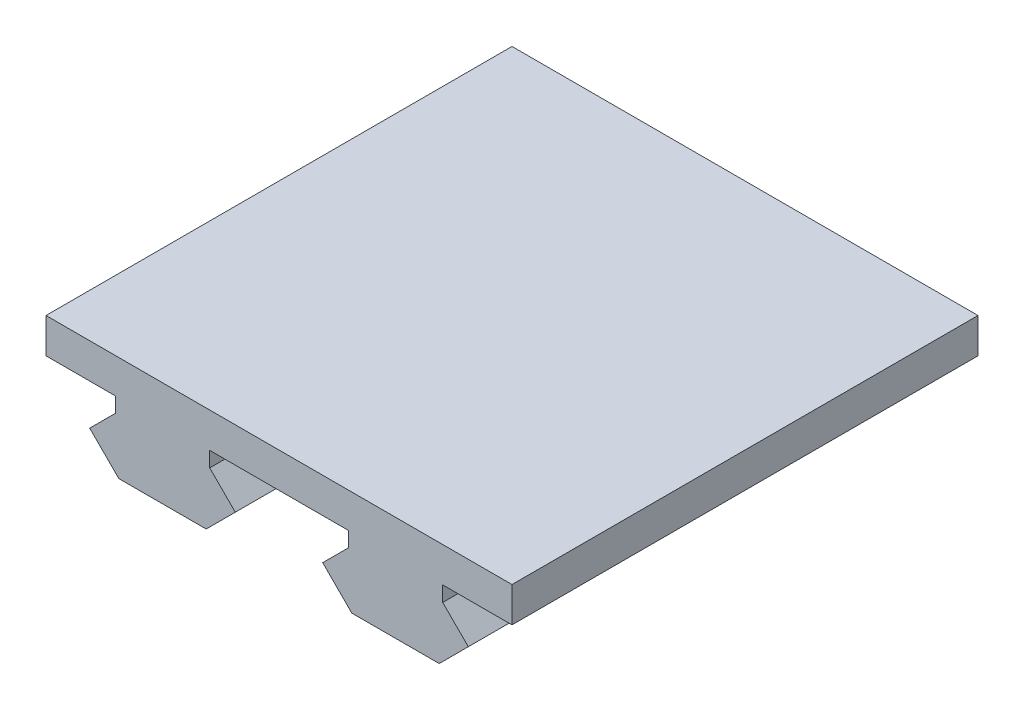
ISO-10303-21;
HEADER;
FILE_DESCRIPTION(('STEP AP214'),'2;1');
FILE_NAME('part.step','',(''),(''),'','','');
FILE_SCHEMA(('AUTOMOTIVE_DESIGN { 1 0 10303 214 1 1 1 1 }'));
ENDSEC;
DATA;
#1=APPLICATION_CONTEXT('core data for automotive mechanical design processes');
#2=APPLICATION_PROTOCOL_DEFINITION('international standard','automotive_design',2000,#1);
#3=PRODUCT_CONTEXT('',#1,'mechanical');
#4=PRODUCT('Part','Part','',(#3));
#5=PRODUCT_RELATED_PRODUCT_CATEGORY('part','',(#4));
#6=PRODUCT_DEFINITION_FORMATION('','',#4);
#7=PRODUCT_DEFINITION_CONTEXT('part definition',#1,'design');
#8=PRODUCT_DEFINITION('design','',#6,#7);
#9=PRODUCT_DEFINITION_SHAPE('','',#8);
#10=(LENGTH_UNIT() NAMED_UNIT(*) SI_UNIT(.MILLI.,.METRE.));
#11=(NAMED_UNIT(*) PLANE_ANGLE_UNIT() SI_UNIT($,.RADIAN.));
#12=(NAMED_UNIT(*) SI_UNIT($,.STERADIAN.) SOLID_ANGLE_UNIT());
#13=UNCERTAINTY_MEASURE_WITH_UNIT(LENGTH_MEASURE(1.E-05),#10,'distance_accuracy_value','');
#14=(GEOMETRIC_REPRESENTATION_CONTEXT(3) GLOBAL_UNCERTAINTY_ASSIGNED_CONTEXT((#13)) GLOBAL_UNIT_ASSIGNED_CONTEXT((#10,
#11,#12)) REPRESENTATION_CONTEXT('',''));
#15=CARTESIAN_POINT('',(0.,0.,0.));
#16=DIRECTION('',(0.,0.,1.));
#17=DIRECTION('',(1.,0.,0.));
#18=AXIS2_PLACEMENT_3D('',#15,#16,#17);
#19=CARTESIAN_POINT('',(3.75,-3.50000000000003,-33.865424623862));
#20=DIRECTION('',(0.707106781186551,-0.707106781186544,0.));
#21=DIRECTION('',(0.707106781186544,0.707106781186551,0.));
#22=AXIS2_PLACEMENT_3D('',#19,#20,#21);
#23=PLANE('',#22);
#24=DIRECTION('',(-0.707106781186544,-0.707106781186551,0.));
#25=VECTOR('',#24,1.);
#26=CARTESIAN_POINT('',(3.75,-3.50000000000003,-6.66666666666667));
#27=LINE('',#26,#25);
#28=CARTESIAN_POINT('',(5.9464983078676,-1.3035016921324,-6.66666666666667));
#29=VERTEX_POINT('',#28);
#30=CARTESIAN_POINT('',(3.75,-3.50000000000003,-6.66666666666667));
#31=VERTEX_POINT('',#30);
#32=EDGE_CURVE('E275',#29,#31,#27,.T.);
#33=ORIENTED_EDGE('',*,*,#32,.F.);
#34=DIRECTION('',(0.,0.,1.));
#35=VECTOR('',#34,1.);
#36=CARTESIAN_POINT('',(5.9464983078676,-1.3035016921324,-33.865424623862));
#37=LINE('',#36,#35);
#38=CARTESIAN_POINT('',(5.9464983078676,-1.3035016921324,-20.));
#39=VERTEX_POINT('',#38);
#40=EDGE_CURVE('E305',#39,#29,#37,.T.);
#41=ORIENTED_EDGE('',*,*,#40,.F.);
#42=DIRECTION('',(-0.707106781186544,-0.707106781186551,0.));
#43=VECTOR('',#42,1.);
#44=CARTESIAN_POINT('',(3.75,-3.50000000000003,-20.));
#45=LINE('',#44,#43);
#46=CARTESIAN_POINT('',(3.75,-3.50000000000003,-20.));
#47=VERTEX_POINT('',#46);
#48=EDGE_CURVE('E309',#39,#47,#45,.T.);
#49=ORIENTED_EDGE('',*,*,#48,.T.);
#50=DIRECTION('',(0.,0.,1.));
#51=VECTOR('',#50,1.);
#52=CARTESIAN_POINT('',(3.75,-3.50000000000003,-33.865424623862));
#53=LINE('',#52,#51);
#54=EDGE_CURVE('E301',#47,#31,#53,.T.);
#55=ORIENTED_EDGE('',*,*,#54,.T.);
#56=EDGE_LOOP('',(#33,#41,#49,#55));
#57=FACE_BOUND('',#56,.T.);
#58=ADVANCED_FACE('F33',(#57),#23,.F.);
#59=CARTESIAN_POINT('',(6.25,-6.,-33.865424623862));
#60=DIRECTION('',(0.707106781186544,0.707106781186551,0.));
#61=DIRECTION('',(-0.707106781186551,0.707106781186544,0.));
#62=AXIS2_PLACEMENT_3D('',#59,#60,#61);
#63=PLANE('',#62);
#64=DIRECTION('',(0.707106781186551,-0.707106781186544,0.));
#65=VECTOR('',#64,1.);
#66=CARTESIAN_POINT('',(6.25,-6.,-6.66666666666667));
#67=LINE('',#66,#65);
#68=CARTESIAN_POINT('',(6.25,-6.,-6.66666666666667));
#69=VERTEX_POINT('',#68);
#70=EDGE_CURVE('E530',#31,#69,#67,.T.);
#71=ORIENTED_EDGE('',*,*,#70,.F.);
#72=ORIENTED_EDGE('',*,*,#54,.F.);
#73=DIRECTION('',(0.707106781186551,-0.707106781186544,0.));
#74=VECTOR('',#73,1.);
#75=CARTESIAN_POINT('',(6.25,-6.,-20.));
#76=LINE('',#75,#74);
#77=CARTESIAN_POINT('',(6.25,-6.,-20.));
#78=VERTEX_POINT('',#77);
#79=EDGE_CURVE('E312',#47,#78,#76,.T.);
#80=ORIENTED_EDGE('',*,*,#79,.T.);
#81=DIRECTION('',(0.,0.,1.));
#82=VECTOR('',#81,1.);
#83=CARTESIAN_POINT('',(6.25,-6.,-33.865424623862));
#84=LINE('',#83,#82);
#85=EDGE_CURVE('E291',#78,#69,#84,.T.);
#86=ORIENTED_EDGE('',*,*,#85,.T.);
#87=EDGE_LOOP('',(#71,#72,#80,#86));
#88=FACE_BOUND('',#87,.T.);
#89=ADVANCED_FACE('F552',(#88),#63,.F.);
#90=CARTESIAN_POINT('',(13.75,-6.,-33.865424623862));
#91=DIRECTION('',(0.,1.,0.));
#92=DIRECTION('',(-1.,0.,0.));
#93=AXIS2_PLACEMENT_3D('',#90,#91,#92);
#94=PLANE('',#93);
#95=DIRECTION('',(-1.,0.,0.));
#96=VECTOR('',#95,1.);
#97=CARTESIAN_POINT('',(20.,-6.,-6.66666666666667));
#98=LINE('',#97,#96);
#99=CARTESIAN_POINT('',(13.75,-6.,-6.66666666666667));
#100=VERTEX_POINT('',#99);
#101=EDGE_CURVE('E539',#100,#69,#98,.T.);
#102=ORIENTED_EDGE('',*,*,#101,.T.);
#103=ORIENTED_EDGE('',*,*,#85,.F.);
#104=DIRECTION('',(1.,0.,0.));
#105=VECTOR('',#104,1.);
#106=CARTESIAN_POINT('',(13.75,-6.,-20.));
#107=LINE('',#106,#105);
#108=CARTESIAN_POINT('',(13.75,-6.,-20.));
#109=VERTEX_POINT('',#108);
#110=EDGE_CURVE('E520',#78,#109,#107,.T.);
#111=ORIENTED_EDGE('',*,*,#110,.T.);
#112=DIRECTION('',(0.,0.,1.));
#113=VECTOR('',#112,1.);
#114=CARTESIAN_POINT('',(13.75,-6.,-33.865424623862));
#115=LINE('',#114,#113);
#116=EDGE_CURVE('E290',#109,#100,#115,.T.);
#117=ORIENTED_EDGE('',*,*,#116,.T.);
#118=EDGE_LOOP('',(#102,#103,#111,#117));
#119=FACE_BOUND('',#118,.T.);
#120=ADVANCED_FACE('F547',(#119),#94,.F.);
#121=CARTESIAN_POINT('',(13.75,-6.,-33.865424623862));
#122=DIRECTION('',(-0.707106781186543,0.707106781186551,0.));
#123=DIRECTION('',(-0.707106781186552,-0.707106781186543,0.));
#124=AXIS2_PLACEMENT_3D('',#121,#122,#123);
#125=PLANE('',#124);
#126=DIRECTION('',(0.707106781186552,0.707106781186543,0.));
#127=VECTOR('',#126,1.);
#128=CARTESIAN_POINT('',(13.75,-6.,-6.66666666666667));
#129=LINE('',#128,#127);
#130=CARTESIAN_POINT('',(16.25,-3.50000000000003,-6.66666666666667));
#131=VERTEX_POINT('',#130);
#132=EDGE_CURVE('E512',#100,#131,#129,.T.);
#133=ORIENTED_EDGE('',*,*,#132,.F.);
#134=ORIENTED_EDGE('',*,*,#116,.F.);
#135=DIRECTION('',(0.707106781186552,0.707106781186543,0.));
#136=VECTOR('',#135,1.);
#137=CARTESIAN_POINT('',(13.75,-6.,-20.));
#138=LINE('',#137,#136);
#139=CARTESIAN_POINT('',(16.25,-3.50000000000003,-20.));
#140=VERTEX_POINT('',#139);
#141=EDGE_CURVE('E518',#109,#140,#138,.T.);
#142=ORIENTED_EDGE('',*,*,#141,.T.);
#143=DIRECTION('',(0.,0.,1.));
#144=VECTOR('',#143,1.);
#145=CARTESIAN_POINT('',(16.25,-3.50000000000003,-33.865424623862));
#146=LINE('',#145,#144);
#147=EDGE_CURVE('E298',#140,#131,#146,.T.);
#148=ORIENTED_EDGE('',*,*,#147,.T.);
#149=EDGE_LOOP('',(#133,#134,#142,#148));
#150=FACE_BOUND('',#149,.T.);
#151=ADVANCED_FACE('F556',(#150),#125,.F.);
#152=CARTESIAN_POINT('',(16.25,-3.50000000000003,-33.865424623862));
#153=DIRECTION('',(-0.707106781186551,-0.707106781186544,0.));
#154=DIRECTION('',(0.707106781186544,-0.707106781186551,0.));
#155=AXIS2_PLACEMENT_3D('',#152,#153,#154);
#156=PLANE('',#155);
#157=DIRECTION('',(-0.707106781186544,0.707106781186551,0.));
#158=VECTOR('',#157,1.);
#159=CARTESIAN_POINT('',(16.25,-3.50000000000003,-6.66666666666667));
#160=LINE('',#159,#158);
#161=CARTESIAN_POINT('',(14.0535016921324,-1.3035016921324,-6.66666666666667));
#162=VERTEX_POINT('',#161);
#163=EDGE_CURVE('E526',#131,#162,#160,.T.);
#164=ORIENTED_EDGE('',*,*,#163,.F.);
#165=ORIENTED_EDGE('',*,*,#147,.F.);
#166=DIRECTION('',(-0.707106781186544,0.707106781186551,0.));
#167=VECTOR('',#166,1.);
#168=CARTESIAN_POINT('',(16.25,-3.50000000000003,-20.));
#169=LINE('',#168,#167);
#170=CARTESIAN_POINT('',(14.0535016921324,-1.30350169213241,-20.));
#171=VERTEX_POINT('',#170);
#172=EDGE_CURVE('E516',#140,#171,#169,.T.);
#173=ORIENTED_EDGE('',*,*,#172,.T.);
#174=DIRECTION('',(0.,0.,1.));
#175=VECTOR('',#174,1.);
#176=CARTESIAN_POINT('',(14.0535016921324,-1.3035016921324,-33.865424623862));
#177=LINE('',#176,#175);
#178=EDGE_CURVE('E486',#171,#162,#177,.T.);
#179=ORIENTED_EDGE('',*,*,#178,.T.);
#180=EDGE_LOOP('',(#164,#165,#173,#179));
#181=FACE_BOUND('',#180,.T.);
#182=ADVANCED_FACE('F559',(#181),#156,.F.);
#183=CARTESIAN_POINT('',(14.0535016921324,-1.3035016921324,-33.865424623862));
#184=DIRECTION('',(-1.,0.,0.));
#185=DIRECTION('',(0.,-1.,0.));
#186=AXIS2_PLACEMENT_3D('',#183,#184,#185);
#187=PLANE('',#186);
#188=DIRECTION('',(0.,1.,0.));
#189=VECTOR('',#188,1.);
#190=CARTESIAN_POINT('',(14.0535016921324,-1.3035016921324,-6.66666666666667));
#191=LINE('',#190,#189);
#192=CARTESIAN_POINT('',(14.0535016921324,0.,-6.66666666666667));
#193=VERTEX_POINT('',#192);
#194=EDGE_CURVE('E528',#162,#193,#191,.T.);
#195=ORIENTED_EDGE('',*,*,#194,.F.);
#196=ORIENTED_EDGE('',*,*,#178,.F.);
#197=DIRECTION('',(0.,1.,0.));
#198=VECTOR('',#197,1.);
#199=CARTESIAN_POINT('',(14.0535016921324,-1.3035016921324,-20.));
#200=LINE('',#199,#198);
#201=CARTESIAN_POINT('',(14.0535016921324,0.,-20.));
#202=VERTEX_POINT('',#201);
#203=EDGE_CURVE('E514',#171,#202,#200,.T.);
#204=ORIENTED_EDGE('',*,*,#203,.T.);
#205=DIRECTION('',(0.,0.,1.));
#206=VECTOR('',#205,1.);
#207=CARTESIAN_POINT('',(14.0535016921324,0.,-33.865424623862));
#208=LINE('',#207,#206);
#209=EDGE_CURVE('E483',#202,#193,#208,.T.);
#210=ORIENTED_EDGE('',*,*,#209,.T.);
#211=EDGE_LOOP('',(#195,#196,#204,#210));
#212=FACE_BOUND('',#211,.T.);
#213=ADVANCED_FACE('F561',(#212),#187,.F.);
#214=CARTESIAN_POINT('',(5.9464983078676,-1.3035016921324,-33.865424623862));
#215=DIRECTION('',(1.,0.,0.));
#216=DIRECTION('',(0.,1.,0.));
#217=AXIS2_PLACEMENT_3D('',#214,#215,#216);
#218=PLANE('',#217);
#219=DIRECTION('',(0.,-1.,0.));
#220=VECTOR('',#219,1.);
#221=CARTESIAN_POINT('',(5.9464983078676,-1.3035016921324,-6.66666666666667));
#222=LINE('',#221,#220);
#223=CARTESIAN_POINT('',(5.9464983078676,0.,-6.66666666666667));
#224=VERTEX_POINT('',#223);
#225=EDGE_CURVE('E11',#224,#29,#222,.T.);
#226=ORIENTED_EDGE('',*,*,#225,.F.);
#227=DIRECTION('',(0.,0.,1.));
#228=VECTOR('',#227,1.);
#229=CARTESIAN_POINT('',(5.9464983078676,0.,-33.865424623862));
#230=LINE('',#229,#228);
#231=CARTESIAN_POINT('',(5.9464983078676,0.,-20.));
#232=VERTEX_POINT('',#231);
#233=EDGE_CURVE('E56',#232,#224,#230,.T.);
#234=ORIENTED_EDGE('',*,*,#233,.F.);
#235=DIRECTION('',(0.,-1.,0.));
#236=VECTOR('',#235,1.);
#237=CARTESIAN_POINT('',(5.9464983078676,-1.3035016921324,-20.));
#238=LINE('',#237,#236);
#239=EDGE_CURVE('E324',#232,#39,#238,.T.);
#240=ORIENTED_EDGE('',*,*,#239,.T.);
#241=ORIENTED_EDGE('',*,*,#40,.T.);
#242=EDGE_LOOP('',(#226,#234,#240,#241));
#243=FACE_BOUND('',#242,.T.);
#244=ADVANCED_FACE('F567',(#243),#218,.F.);
#245=CARTESIAN_POINT('',(0.,0.,0.));
#246=DIRECTION('',(0.,-1.,0.));
#247=DIRECTION('',(0.,0.,-1.));
#248=AXIS2_PLACEMENT_3D('',#245,#246,#247);
#249=PLANE('',#248);
#250=ORIENTED_EDGE('',*,*,#233,.T.);
#251=DIRECTION('',(-1.,0.,0.));
#252=VECTOR('',#251,1.);
#253=CARTESIAN_POINT('',(20.,0.,-6.66666666666667));
#254=LINE('',#253,#252);
#255=EDGE_CURVE('E542',#193,#224,#254,.T.);
#256=ORIENTED_EDGE('',*,*,#255,.F.);
#257=ORIENTED_EDGE('',*,*,#209,.F.);
#258=DIRECTION('',(-1.,0.,0.));
#259=VECTOR('',#258,1.);
#260=CARTESIAN_POINT('',(-20.,0.,-20.));
#261=LINE('',#260,#259);
#262=CARTESIAN_POINT('',(20.,0.,-20.));
#263=VERTEX_POINT('',#262);
#264=EDGE_CURVE('E431',#263,#202,#261,.T.);
#265=ORIENTED_EDGE('',*,*,#264,.F.);
#266=DIRECTION('',(0.,0.,-1.));
#267=VECTOR('',#266,1.);
#268=CARTESIAN_POINT('',(20.,0.,20.));
#269=LINE('',#268,#267);
#270=CARTESIAN_POINT('',(20.,0.,20.));
#271=VERTEX_POINT('',#270);
#272=EDGE_CURVE('E366',#271,#263,#269,.T.);
#273=ORIENTED_EDGE('',*,*,#272,.F.);
#274=DIRECTION('',(1.,0.,0.));
#275=VECTOR('',#274,1.);
#276=CARTESIAN_POINT('',(-20.,0.,20.));
#277=LINE('',#276,#275);
#278=CARTESIAN_POINT('',(14.0535016921324,0.,20.));
#279=VERTEX_POINT('',#278);
#280=EDGE_CURVE('E437',#279,#271,#277,.T.);
#281=ORIENTED_EDGE('',*,*,#280,.F.);
#282=CARTESIAN_POINT('',(14.0535016921324,0.,6.66666666666667));
#283=VERTEX_POINT('',#282);
#284=EDGE_CURVE('E485',#283,#279,#208,.T.);
#285=ORIENTED_EDGE('',*,*,#284,.F.);
#286=DIRECTION('',(-1.,0.,0.));
#287=VECTOR('',#286,1.);
#288=CARTESIAN_POINT('',(20.,0.,6.66666666666667));
#289=LINE('',#288,#287);
#290=CARTESIAN_POINT('',(5.9464983078676,0.,6.66666666666667));
#291=VERTEX_POINT('',#290);
#292=EDGE_CURVE('E284',#283,#291,#289,.T.);
#293=ORIENTED_EDGE('',*,*,#292,.T.);
#294=CARTESIAN_POINT('',(5.9464983078676,0.,20.));
#295=VERTEX_POINT('',#294);
#296=EDGE_CURVE('E462',#291,#295,#230,.T.);
#297=ORIENTED_EDGE('',*,*,#296,.T.);
#298=CARTESIAN_POINT('',(-5.9464983078676,0.,20.));
#299=VERTEX_POINT('',#298);
#300=EDGE_CURVE('E440',#299,#295,#277,.T.);
#301=ORIENTED_EDGE('',*,*,#300,.F.);
#302=DIRECTION('',(0.,0.,1.));
#303=VECTOR('',#302,1.);
#304=CARTESIAN_POINT('',(-5.9464983078676,0.,-33.865424623862));
#305=LINE('',#304,#303);
#306=CARTESIAN_POINT('',(-5.9464983078676,0.,6.66666666666667));
#307=VERTEX_POINT('',#306);
#308=EDGE_CURVE('E387',#307,#299,#305,.T.);
#309=ORIENTED_EDGE('',*,*,#308,.F.);
#310=DIRECTION('',(1.,0.,0.));
#311=VECTOR('',#310,1.);
#312=CARTESIAN_POINT('',(-20.,0.,6.66666666666667));
#313=LINE('',#312,#311);
#314=CARTESIAN_POINT('',(-14.0535016921324,0.,6.66666666666667));
#315=VERTEX_POINT('',#314);
#316=EDGE_CURVE('E317',#315,#307,#313,.T.);
#317=ORIENTED_EDGE('',*,*,#316,.F.);
#318=DIRECTION('',(0.,0.,1.));
#319=VECTOR('',#318,1.);
#320=CARTESIAN_POINT('',(-14.0535016921324,0.,-33.865424623862));
#321=LINE('',#320,#319);
#322=CARTESIAN_POINT('',(-14.0535016921324,0.,20.));
#323=VERTEX_POINT('',#322);
#324=EDGE_CURVE('E414',#315,#323,#321,.T.);
#325=ORIENTED_EDGE('',*,*,#324,.T.);
#326=CARTESIAN_POINT('',(-20.,0.,20.));
#327=VERTEX_POINT('',#326);
#328=EDGE_CURVE('E422',#327,#323,#277,.T.);
#329=ORIENTED_EDGE('',*,*,#328,.F.);
#330=DIRECTION('',(0.,0.,1.));
#331=VECTOR('',#330,1.);
#332=CARTESIAN_POINT('',(-20.,0.,20.));
#333=LINE('',#332,#331);
#334=CARTESIAN_POINT('',(-20.,0.,-20.));
#335=VERTEX_POINT('',#334);
#336=EDGE_CURVE('E434',#335,#327,#333,.T.);
#337=ORIENTED_EDGE('',*,*,#336,.F.);
#338=CARTESIAN_POINT('',(-14.0535016921324,0.,-20.));
#339=VERTEX_POINT('',#338);
#340=EDGE_CURVE('E430',#339,#335,#261,.T.);
#341=ORIENTED_EDGE('',*,*,#340,.F.);
#342=CARTESIAN_POINT('',(-14.0535016921324,0.,-6.66666666666667));
#343=VERTEX_POINT('',#342);
#344=EDGE_CURVE('E411',#339,#343,#321,.T.);
#345=ORIENTED_EDGE('',*,*,#344,.T.);
#346=DIRECTION('',(1.,0.,0.));
#347=VECTOR('',#346,1.);
#348=CARTESIAN_POINT('',(-20.,0.,-6.66666666666667));
#349=LINE('',#348,#347);
#350=CARTESIAN_POINT('',(-5.9464983078676,0.,-6.66666666666667));
#351=VERTEX_POINT('',#350);
#352=EDGE_CURVE('E319',#343,#351,#349,.T.);
#353=ORIENTED_EDGE('',*,*,#352,.T.);
#354=CARTESIAN_POINT('',(-5.9464983078676,0.,-20.));
#355=VERTEX_POINT('',#354);
#356=EDGE_CURVE('E415',#355,#351,#305,.T.);
#357=ORIENTED_EDGE('',*,*,#356,.F.);
#358=EDGE_CURVE('E435',#232,#355,#261,.T.);
#359=ORIENTED_EDGE('',*,*,#358,.F.);
#360=EDGE_LOOP('',(#250,#256,#257,#265,#273,#281,#285,#293,#297,#301,#309,#317,#325,#329,#337,
#341,#345,#353,#357,#359));
#361=FACE_BOUND('',#360,.T.);
#362=ADVANCED_FACE('F638',(#361),#249,.T.);
#363=CARTESIAN_POINT('',(-5.9464983078676,-1.3035016921324,-33.865424623862));
#364=DIRECTION('',(1.,0.,0.));
#365=DIRECTION('',(0.,1.,0.));
#366=AXIS2_PLACEMENT_3D('',#363,#364,#365);
#367=PLANE('',#366);
#368=DIRECTION('',(0.,0.,1.));
#369=VECTOR('',#368,1.);
#370=CARTESIAN_POINT('',(-5.9464983078676,-1.3035016921324,-33.865424623862));
#371=LINE('',#370,#369);
#372=CARTESIAN_POINT('',(-5.9464983078676,-1.3035016921324,6.66666666666667));
#373=VERTEX_POINT('',#372);
#374=CARTESIAN_POINT('',(-5.9464983078676,-1.3035016921324,20.));
#375=VERTEX_POINT('',#374);
#376=EDGE_CURVE('E390',#373,#375,#371,.T.);
#377=ORIENTED_EDGE('',*,*,#376,.F.);
#378=DIRECTION('',(0.,1.,0.));
#379=VECTOR('',#378,1.);
#380=CARTESIAN_POINT('',(-5.9464983078676,-1.3035016921324,6.66666666666667));
#381=LINE('',#380,#379);
#382=EDGE_CURVE('E346',#373,#307,#381,.T.);
#383=ORIENTED_EDGE('',*,*,#382,.T.);
#384=ORIENTED_EDGE('',*,*,#308,.T.);
#385=DIRECTION('',(0.,1.,0.));
#386=VECTOR('',#385,1.);
#387=CARTESIAN_POINT('',(-5.9464983078676,-1.3035016921324,20.));
#388=LINE('',#387,#386);
#389=EDGE_CURVE('E349',#375,#299,#388,.T.);
#390=ORIENTED_EDGE('',*,*,#389,.F.);
#391=EDGE_LOOP('',(#377,#383,#384,#390));
#392=FACE_BOUND('',#391,.T.);
#393=ADVANCED_FACE('F635',(#392),#367,.T.);
#394=CARTESIAN_POINT('',(-3.75,-3.50000000000003,-33.865424623862));
#395=DIRECTION('',(0.707106781186551,0.707106781186544,0.));
#396=DIRECTION('',(-0.707106781186544,0.707106781186551,0.));
#397=AXIS2_PLACEMENT_3D('',#394,#395,#396);
#398=PLANE('',#397);
#399=DIRECTION('',(0.,0.,1.));
#400=VECTOR('',#399,1.);
#401=CARTESIAN_POINT('',(-3.75,-3.50000000000003,-33.865424623862));
#402=LINE('',#401,#400);
#403=CARTESIAN_POINT('',(-3.75,-3.50000000000003,6.66666666666667));
#404=VERTEX_POINT('',#403);
#405=CARTESIAN_POINT('',(-3.75,-3.50000000000003,20.));
#406=VERTEX_POINT('',#405);
#407=EDGE_CURVE('E394',#404,#406,#402,.T.);
#408=ORIENTED_EDGE('',*,*,#407,.F.);
#409=DIRECTION('',(-0.707106781186544,0.707106781186551,0.));
#410=VECTOR('',#409,1.);
#411=CARTESIAN_POINT('',(-3.75,-3.50000000000003,6.66666666666667));
#412=LINE('',#411,#410);
#413=EDGE_CURVE('E343',#404,#373,#412,.T.);
#414=ORIENTED_EDGE('',*,*,#413,.T.);
#415=ORIENTED_EDGE('',*,*,#376,.T.);
#416=DIRECTION('',(-0.707106781186544,0.707106781186551,0.));
#417=VECTOR('',#416,1.);
#418=CARTESIAN_POINT('',(-3.75,-3.50000000000003,20.));
#419=LINE('',#418,#417);
#420=EDGE_CURVE('E384',#406,#375,#419,.T.);
#421=ORIENTED_EDGE('',*,*,#420,.F.);
#422=EDGE_LOOP('',(#408,#414,#415,#421));
#423=FACE_BOUND('',#422,.T.);
#424=ADVANCED_FACE('F607',(#423),#398,.T.);
#425=CARTESIAN_POINT('',(-6.25,-6.,-33.865424623862));
#426=DIRECTION('',(0.707106781186544,-0.707106781186551,0.));
#427=DIRECTION('',(0.707106781186551,0.707106781186544,0.));
#428=AXIS2_PLACEMENT_3D('',#425,#426,#427);
#429=PLANE('',#428);
#430=DIRECTION('',(0.,0.,1.));
#431=VECTOR('',#430,1.);
#432=CARTESIAN_POINT('',(-6.25,-6.,-33.865424623862));
#433=LINE('',#432,#431);
#434=CARTESIAN_POINT('',(-6.25,-6.,6.66666666666667));
#435=VERTEX_POINT('',#434);
#436=CARTESIAN_POINT('',(-6.25,-6.,20.));
#437=VERTEX_POINT('',#436);
#438=EDGE_CURVE('E398',#435,#437,#433,.T.);
#439=ORIENTED_EDGE('',*,*,#438,.F.);
#440=DIRECTION('',(0.707106781186551,0.707106781186544,0.));
#441=VECTOR('',#440,1.);
#442=CARTESIAN_POINT('',(-6.25,-6.,6.66666666666667));
#443=LINE('',#442,#441);
#444=EDGE_CURVE('E340',#435,#404,#443,.T.);
#445=ORIENTED_EDGE('',*,*,#444,.T.);
#446=ORIENTED_EDGE('',*,*,#407,.T.);
#447=DIRECTION('',(0.707106781186551,0.707106781186544,0.));
#448=VECTOR('',#447,1.);
#449=CARTESIAN_POINT('',(-6.25,-6.,20.));
#450=LINE('',#449,#448);
#451=EDGE_CURVE('E381',#437,#406,#450,.T.);
#452=ORIENTED_EDGE('',*,*,#451,.F.);
#453=EDGE_LOOP('',(#439,#445,#446,#452));
#454=FACE_BOUND('',#453,.T.);
#455=ADVANCED_FACE('F612',(#454),#429,.T.);
#456=CARTESIAN_POINT('',(-13.75,-6.,-33.865424623862));
#457=DIRECTION('',(0.,-1.,0.));
#458=DIRECTION('',(1.,0.,0.));
#459=AXIS2_PLACEMENT_3D('',#456,#457,#458);
#460=PLANE('',#459);
#461=DIRECTION('',(0.,0.,1.));
#462=VECTOR('',#461,1.);
#463=CARTESIAN_POINT('',(-13.75,-6.,-33.865424623862));
#464=LINE('',#463,#462);
#465=CARTESIAN_POINT('',(-13.75,-6.,6.66666666666667));
#466=VERTEX_POINT('',#465);
#467=CARTESIAN_POINT('',(-13.75,-6.,20.));
#468=VERTEX_POINT('',#467);
#469=EDGE_CURVE('E402',#466,#468,#464,.T.);
#470=ORIENTED_EDGE('',*,*,#469,.F.);
#471=DIRECTION('',(1.,0.,0.));
#472=VECTOR('',#471,1.);
#473=CARTESIAN_POINT('',(-20.,-6.,6.66666666666667));
#474=LINE('',#473,#472);
#475=EDGE_CURVE('E313',#466,#435,#474,.T.);
#476=ORIENTED_EDGE('',*,*,#475,.T.);
#477=ORIENTED_EDGE('',*,*,#438,.T.);
#478=DIRECTION('',(1.,0.,0.));
#479=VECTOR('',#478,1.);
#480=CARTESIAN_POINT('',(-13.75,-6.,20.));
#481=LINE('',#480,#479);
#482=EDGE_CURVE('E378',#468,#437,#481,.T.);
#483=ORIENTED_EDGE('',*,*,#482,.F.);
#484=EDGE_LOOP('',(#470,#476,#477,#483));
#485=FACE_BOUND('',#484,.T.);
#486=ADVANCED_FACE('F617',(#485),#460,.T.);
#487=CARTESIAN_POINT('',(-13.75,-6.,-33.865424623862));
#488=DIRECTION('',(-0.707106781186543,-0.707106781186551,0.));
#489=DIRECTION('',(0.707106781186552,-0.707106781186543,0.));
#490=AXIS2_PLACEMENT_3D('',#487,#488,#489);
#491=PLANE('',#490);
#492=DIRECTION('',(0.,0.,1.));
#493=VECTOR('',#492,1.);
#494=CARTESIAN_POINT('',(-16.25,-3.50000000000003,-33.865424623862));
#495=LINE('',#494,#493);
#496=CARTESIAN_POINT('',(-16.25,-3.50000000000003,6.66666666666667));
#497=VERTEX_POINT('',#496);
#498=CARTESIAN_POINT('',(-16.25,-3.50000000000003,20.));
#499=VERTEX_POINT('',#498);
#500=EDGE_CURVE('E406',#497,#499,#495,.T.);
#501=ORIENTED_EDGE('',*,*,#500,.F.);
#502=DIRECTION('',(0.707106781186552,-0.707106781186543,0.));
#503=VECTOR('',#502,1.);
#504=CARTESIAN_POINT('',(-13.75,-6.,6.66666666666667));
#505=LINE('',#504,#503);
#506=EDGE_CURVE('E337',#497,#466,#505,.T.);
#507=ORIENTED_EDGE('',*,*,#506,.T.);
#508=ORIENTED_EDGE('',*,*,#469,.T.);
#509=DIRECTION('',(0.707106781186552,-0.707106781186543,0.));
#510=VECTOR('',#509,1.);
#511=CARTESIAN_POINT('',(-13.75,-6.,20.));
#512=LINE('',#511,#510);
#513=EDGE_CURVE('E375',#499,#468,#512,.T.);
#514=ORIENTED_EDGE('',*,*,#513,.F.);
#515=EDGE_LOOP('',(#501,#507,#508,#514));
#516=FACE_BOUND('',#515,.T.);
#517=ADVANCED_FACE('F622',(#516),#491,.T.);
#518=CARTESIAN_POINT('',(-16.25,-3.50000000000003,-33.865424623862));
#519=DIRECTION('',(-0.707106781186551,0.707106781186544,0.));
#520=DIRECTION('',(-0.707106781186544,-0.707106781186551,0.));
#521=AXIS2_PLACEMENT_3D('',#518,#519,#520);
#522=PLANE('',#521);
#523=DIRECTION('',(0.,0.,1.));
#524=VECTOR('',#523,1.);
#525=CARTESIAN_POINT('',(-14.0535016921324,-1.3035016921324,-33.865424623862));
#526=LINE('',#525,#524);
#527=CARTESIAN_POINT('',(-14.0535016921324,-1.3035016921324,6.66666666666667));
#528=VERTEX_POINT('',#527);
#529=CARTESIAN_POINT('',(-14.0535016921324,-1.3035016921324,20.));
#530=VERTEX_POINT('',#529);
#531=EDGE_CURVE('E410',#528,#530,#526,.T.);
#532=ORIENTED_EDGE('',*,*,#531,.F.);
#533=DIRECTION('',(-0.707106781186544,-0.707106781186551,0.));
#534=VECTOR('',#533,1.);
#535=CARTESIAN_POINT('',(-16.25,-3.50000000000003,6.66666666666667));
#536=LINE('',#535,#534);
#537=EDGE_CURVE('E334',#528,#497,#536,.T.);
#538=ORIENTED_EDGE('',*,*,#537,.T.);
#539=ORIENTED_EDGE('',*,*,#500,.T.);
#540=DIRECTION('',(-0.707106781186544,-0.707106781186551,0.));
#541=VECTOR('',#540,1.);
#542=CARTESIAN_POINT('',(-16.25,-3.50000000000003,20.));
#543=LINE('',#542,#541);
#544=EDGE_CURVE('E372',#530,#499,#543,.T.);
#545=ORIENTED_EDGE('',*,*,#544,.F.);
#546=EDGE_LOOP('',(#532,#538,#539,#545));
#547=FACE_BOUND('',#546,.T.);
#548=ADVANCED_FACE('F626',(#547),#522,.T.);
#549=CARTESIAN_POINT('',(-14.0535016921324,-1.3035016921324,-33.865424623862));
#550=DIRECTION('',(-1.,0.,0.));
#551=DIRECTION('',(0.,-1.,0.));
#552=AXIS2_PLACEMENT_3D('',#549,#550,#551);
#553=PLANE('',#552);
#554=ORIENTED_EDGE('',*,*,#324,.F.);
#555=DIRECTION('',(0.,-1.,0.));
#556=VECTOR('',#555,1.);
#557=CARTESIAN_POINT('',(-14.0535016921324,-1.3035016921324,6.66666666666667));
#558=LINE('',#557,#556);
#559=EDGE_CURVE('E454',#315,#528,#558,.T.);
#560=ORIENTED_EDGE('',*,*,#559,.T.);
#561=ORIENTED_EDGE('',*,*,#531,.T.);
#562=DIRECTION('',(0.,-1.,0.));
#563=VECTOR('',#562,1.);
#564=CARTESIAN_POINT('',(-14.0535016921324,-1.3035016921324,20.));
#565=LINE('',#564,#563);
#566=EDGE_CURVE('E369',#323,#530,#565,.T.);
#567=ORIENTED_EDGE('',*,*,#566,.F.);
#568=EDGE_LOOP('',(#554,#560,#561,#567));
#569=FACE_BOUND('',#568,.T.);
#570=ADVANCED_FACE('F630',(#569),#553,.T.);
#571=CARTESIAN_POINT('',(20.,3.,20.));
#572=DIRECTION('',(-1.,0.,0.));
#573=DIRECTION('',(0.,0.,1.));
#574=AXIS2_PLACEMENT_3D('',#571,#572,#573);
#575=PLANE('',#574);
#576=ORIENTED_EDGE('',*,*,#272,.T.);
#577=DIRECTION('',(0.,-1.,0.));
#578=VECTOR('',#577,1.);
#579=CARTESIAN_POINT('',(20.,3.,-20.));
#580=LINE('',#579,#578);
#581=CARTESIAN_POINT('',(20.,3.,-20.));
#582=VERTEX_POINT('',#581);
#583=EDGE_CURVE('E449',#582,#263,#580,.T.);
#584=ORIENTED_EDGE('',*,*,#583,.F.);
#585=DIRECTION('',(0.,0.,-1.));
#586=VECTOR('',#585,1.);
#587=CARTESIAN_POINT('',(20.,3.,20.));
#588=LINE('',#587,#586);
#589=CARTESIAN_POINT('',(20.,3.,20.));
#590=VERTEX_POINT('',#589);
#591=EDGE_CURVE('E418',#590,#582,#588,.T.);
#592=ORIENTED_EDGE('',*,*,#591,.F.);
#593=DIRECTION('',(0.,-1.,0.));
#594=VECTOR('',#593,1.);
#595=CARTESIAN_POINT('',(20.,3.,20.));
#596=LINE('',#595,#594);
#597=EDGE_CURVE('E428',#590,#271,#596,.T.);
#598=ORIENTED_EDGE('',*,*,#597,.T.);
#599=EDGE_LOOP('',(#576,#584,#592,#598));
#600=FACE_BOUND('',#599,.T.);
#601=ADVANCED_FACE('F35',(#600),#575,.F.);
#602=CARTESIAN_POINT('',(-20.,3.,-20.));
#603=DIRECTION('',(0.,0.,1.));
#604=DIRECTION('',(1.,0.,0.));
#605=AXIS2_PLACEMENT_3D('',#602,#603,#604);
#606=PLANE('',#605);
#607=ORIENTED_EDGE('',*,*,#264,.T.);
#608=ORIENTED_EDGE('',*,*,#203,.F.);
#609=ORIENTED_EDGE('',*,*,#172,.F.);
#610=ORIENTED_EDGE('',*,*,#141,.F.);
#611=ORIENTED_EDGE('',*,*,#110,.F.);
#612=ORIENTED_EDGE('',*,*,#79,.F.);
#613=ORIENTED_EDGE('',*,*,#48,.F.);
#614=ORIENTED_EDGE('',*,*,#239,.F.);
#615=ORIENTED_EDGE('',*,*,#358,.T.);
#616=DIRECTION('',(0.,-1.,0.));
#617=VECTOR('',#616,1.);
#618=CARTESIAN_POINT('',(-5.9464983078676,-1.3035016921324,-20.));
#619=LINE('',#618,#617);
#620=CARTESIAN_POINT('',(-5.9464983078676,-1.3035016921324,-20.));
#621=VERTEX_POINT('',#620);
#622=EDGE_CURVE('E364',#355,#621,#619,.T.);
#623=ORIENTED_EDGE('',*,*,#622,.T.);
#624=DIRECTION('',(0.707106781186544,-0.707106781186551,0.));
#625=VECTOR('',#624,1.);
#626=CARTESIAN_POINT('',(-3.75,-3.50000000000003,-20.));
#627=LINE('',#626,#625);
#628=CARTESIAN_POINT('',(-3.75,-3.50000000000003,-20.));
#629=VERTEX_POINT('',#628);
#630=EDGE_CURVE('E362',#621,#629,#627,.T.);
#631=ORIENTED_EDGE('',*,*,#630,.T.);
#632=DIRECTION('',(-0.707106781186551,-0.707106781186544,0.));
#633=VECTOR('',#632,1.);
#634=CARTESIAN_POINT('',(-6.25,-6.,-20.));
#635=LINE('',#634,#633);
#636=CARTESIAN_POINT('',(-6.25,-6.,-20.));
#637=VERTEX_POINT('',#636);
#638=EDGE_CURVE('E360',#629,#637,#635,.T.);
#639=ORIENTED_EDGE('',*,*,#638,.T.);
#640=DIRECTION('',(-1.,0.,0.));
#641=VECTOR('',#640,1.);
#642=CARTESIAN_POINT('',(-13.75,-6.,-20.));
#643=LINE('',#642,#641);
#644=CARTESIAN_POINT('',(-13.75,-6.,-20.));
#645=VERTEX_POINT('',#644);
#646=EDGE_CURVE('E358',#637,#645,#643,.T.);
#647=ORIENTED_EDGE('',*,*,#646,.T.);
#648=DIRECTION('',(-0.707106781186552,0.707106781186543,0.));
#649=VECTOR('',#648,1.);
#650=CARTESIAN_POINT('',(-13.75,-6.,-20.));
#651=LINE('',#650,#649);
#652=CARTESIAN_POINT('',(-16.25,-3.50000000000003,-20.));
#653=VERTEX_POINT('',#652);
#654=EDGE_CURVE('E356',#645,#653,#651,.T.);
#655=ORIENTED_EDGE('',*,*,#654,.T.);
#656=DIRECTION('',(0.707106781186544,0.707106781186551,0.));
#657=VECTOR('',#656,1.);
#658=CARTESIAN_POINT('',(-16.25,-3.50000000000003,-20.));
#659=LINE('',#658,#657);
#660=CARTESIAN_POINT('',(-14.0535016921324,-1.3035016921324,-20.));
#661=VERTEX_POINT('',#660);
#662=EDGE_CURVE('E353',#653,#661,#659,.T.);
#663=ORIENTED_EDGE('',*,*,#662,.T.);
#664=DIRECTION('',(0.,1.,0.));
#665=VECTOR('',#664,1.);
#666=CARTESIAN_POINT('',(-14.0535016921324,-1.3035016921324,-20.));
#667=LINE('',#666,#665);
#668=EDGE_CURVE('E350',#661,#339,#667,.T.);
#669=ORIENTED_EDGE('',*,*,#668,.T.);
#670=ORIENTED_EDGE('',*,*,#340,.T.);
#671=DIRECTION('',(0.,-1.,0.));
#672=VECTOR('',#671,1.);
#673=CARTESIAN_POINT('',(-20.,3.,-20.));
#674=LINE('',#673,#672);
#675=CARTESIAN_POINT('',(-20.,3.,-20.));
#676=VERTEX_POINT('',#675);
#677=EDGE_CURVE('E446',#676,#335,#674,.T.);
#678=ORIENTED_EDGE('',*,*,#677,.F.);
#679=DIRECTION('',(-1.,0.,0.));
#680=VECTOR('',#679,1.);
#681=CARTESIAN_POINT('',(-20.,3.,-20.));
#682=LINE('',#681,#680);
#683=EDGE_CURVE('E421',#582,#676,#682,.T.);
#684=ORIENTED_EDGE('',*,*,#683,.F.);
#685=ORIENTED_EDGE('',*,*,#583,.T.);
#686=EDGE_LOOP('',(#607,#608,#609,#610,#611,#612,#613,#614,#615,#623,#631,#639,#647,#655,#663,
#669,#670,#678,#684,#685));
#687=FACE_BOUND('',#686,.T.);
#688=ADVANCED_FACE('F555',(#687),#606,.F.);
#689=CARTESIAN_POINT('',(-20.,3.,20.));
#690=DIRECTION('',(1.,0.,0.));
#691=DIRECTION('',(0.,0.,-1.));
#692=AXIS2_PLACEMENT_3D('',#689,#690,#691);
#693=PLANE('',#692);
#694=ORIENTED_EDGE('',*,*,#336,.T.);
#695=DIRECTION('',(0.,-1.,0.));
#696=VECTOR('',#695,1.);
#697=CARTESIAN_POINT('',(-20.,3.,20.));
#698=LINE('',#697,#696);
#699=CARTESIAN_POINT('',(-20.,3.,20.));
#700=VERTEX_POINT('',#699);
#701=EDGE_CURVE('E443',#700,#327,#698,.T.);
#702=ORIENTED_EDGE('',*,*,#701,.F.);
#703=DIRECTION('',(0.,0.,1.));
#704=VECTOR('',#703,1.);
#705=CARTESIAN_POINT('',(-20.,3.,20.));
#706=LINE('',#705,#704);
#707=EDGE_CURVE('E424',#676,#700,#706,.T.);
#708=ORIENTED_EDGE('',*,*,#707,.F.);
#709=ORIENTED_EDGE('',*,*,#677,.T.);
#710=EDGE_LOOP('',(#694,#702,#708,#709));
#711=FACE_BOUND('',#710,.T.);
#712=ADVANCED_FACE('F644',(#711),#693,.F.);
#713=CARTESIAN_POINT('',(-20.,3.,20.));
#714=DIRECTION('',(0.,0.,-1.));
#715=DIRECTION('',(-1.,0.,0.));
#716=AXIS2_PLACEMENT_3D('',#713,#714,#715);
#717=PLANE('',#716);
#718=ORIENTED_EDGE('',*,*,#328,.T.);
#719=ORIENTED_EDGE('',*,*,#566,.T.);
#720=ORIENTED_EDGE('',*,*,#544,.T.);
#721=ORIENTED_EDGE('',*,*,#513,.T.);
#722=ORIENTED_EDGE('',*,*,#482,.T.);
#723=ORIENTED_EDGE('',*,*,#451,.T.);
#724=ORIENTED_EDGE('',*,*,#420,.T.);
#725=ORIENTED_EDGE('',*,*,#389,.T.);
#726=ORIENTED_EDGE('',*,*,#300,.T.);
#727=DIRECTION('',(0.,1.,0.));
#728=VECTOR('',#727,1.);
#729=CARTESIAN_POINT('',(5.9464983078676,-1.3035016921324,20.));
#730=LINE('',#729,#728);
#731=CARTESIAN_POINT('',(5.9464983078676,-1.3035016921324,20.));
#732=VERTEX_POINT('',#731);
#733=EDGE_CURVE('E510',#732,#295,#730,.T.);
#734=ORIENTED_EDGE('',*,*,#733,.F.);
#735=DIRECTION('',(0.707106781186544,0.707106781186551,0.));
#736=VECTOR('',#735,1.);
#737=CARTESIAN_POINT('',(3.75,-3.50000000000003,20.));
#738=LINE('',#737,#736);
#739=CARTESIAN_POINT('',(3.75,-3.50000000000003,20.));
#740=VERTEX_POINT('',#739);
#741=EDGE_CURVE('E468',#740,#732,#738,.T.);
#742=ORIENTED_EDGE('',*,*,#741,.F.);
#743=DIRECTION('',(-0.707106781186551,0.707106781186544,0.));
#744=VECTOR('',#743,1.);
#745=CARTESIAN_POINT('',(6.25,-6.,20.));
#746=LINE('',#745,#744);
#747=CARTESIAN_POINT('',(6.25,-6.,20.));
#748=VERTEX_POINT('',#747);
#749=EDGE_CURVE('E504',#748,#740,#746,.T.);
#750=ORIENTED_EDGE('',*,*,#749,.F.);
#751=DIRECTION('',(-1.,0.,0.));
#752=VECTOR('',#751,1.);
#753=CARTESIAN_POINT('',(13.75,-6.,20.));
#754=LINE('',#753,#752);
#755=CARTESIAN_POINT('',(13.75,-6.,20.));
#756=VERTEX_POINT('',#755);
#757=EDGE_CURVE('E503',#756,#748,#754,.T.);
#758=ORIENTED_EDGE('',*,*,#757,.F.);
#759=DIRECTION('',(-0.707106781186552,-0.707106781186543,0.));
#760=VECTOR('',#759,1.);
#761=CARTESIAN_POINT('',(13.75,-6.,20.));
#762=LINE('',#761,#760);
#763=CARTESIAN_POINT('',(16.25,-3.50000000000003,20.));
#764=VERTEX_POINT('',#763);
#765=EDGE_CURVE('E288',#764,#756,#762,.T.);
#766=ORIENTED_EDGE('',*,*,#765,.F.);
#767=DIRECTION('',(0.707106781186544,-0.707106781186551,0.));
#768=VECTOR('',#767,1.);
#769=CARTESIAN_POINT('',(16.25,-3.50000000000003,20.));
#770=LINE('',#769,#768);
#771=CARTESIAN_POINT('',(14.0535016921324,-1.3035016921324,20.));
#772=VERTEX_POINT('',#771);
#773=EDGE_CURVE('E472',#772,#764,#770,.T.);
#774=ORIENTED_EDGE('',*,*,#773,.F.);
#775=DIRECTION('',(0.,-1.,0.));
#776=VECTOR('',#775,1.);
#777=CARTESIAN_POINT('',(14.0535016921324,-1.3035016921324,20.));
#778=LINE('',#777,#776);
#779=EDGE_CURVE('E470',#279,#772,#778,.T.);
#780=ORIENTED_EDGE('',*,*,#779,.F.);
#781=ORIENTED_EDGE('',*,*,#280,.T.);
#782=ORIENTED_EDGE('',*,*,#597,.F.);
#783=DIRECTION('',(1.,0.,0.));
#784=VECTOR('',#783,1.);
#785=CARTESIAN_POINT('',(-20.,3.,20.));
#786=LINE('',#785,#784);
#787=EDGE_CURVE('E426',#700,#590,#786,.T.);
#788=ORIENTED_EDGE('',*,*,#787,.F.);
#789=ORIENTED_EDGE('',*,*,#701,.T.);
#790=EDGE_LOOP('',(#718,#719,#720,#721,#722,#723,#724,#725,#726,#734,#742,#750,#758,#766,#774,
#780,#781,#782,#788,#789));
#791=FACE_BOUND('',#790,.T.);
#792=ADVANCED_FACE('F501',(#791),#717,.F.);
#793=CARTESIAN_POINT('',(0.,3.,0.));
#794=DIRECTION('',(0.,-1.,0.));
#795=DIRECTION('',(0.,0.,-1.));
#796=AXIS2_PLACEMENT_3D('',#793,#794,#795);
#797=PLANE('',#796);
#798=ORIENTED_EDGE('',*,*,#591,.T.);
#799=ORIENTED_EDGE('',*,*,#683,.T.);
#800=ORIENTED_EDGE('',*,*,#707,.T.);
#801=ORIENTED_EDGE('',*,*,#787,.T.);
#802=EDGE_LOOP('',(#798,#799,#800,#801));
#803=FACE_BOUND('',#802,.T.);
#804=ADVANCED_FACE('F633',(#803),#797,.F.);
#805=DIRECTION('',(0.,1.,0.));
#806=VECTOR('',#805,1.);
#807=CARTESIAN_POINT('',(-5.9464983078676,-1.3035016921324,-6.66666666666667));
#808=LINE('',#807,#806);
#809=CARTESIAN_POINT('',(-5.9464983078676,-1.3035016921324,-6.66666666666667));
#810=VERTEX_POINT('',#809);
#811=EDGE_CURVE('E332',#810,#351,#808,.T.);
#812=ORIENTED_EDGE('',*,*,#811,.F.);
#813=EDGE_CURVE('E354',#621,#810,#371,.T.);
#814=ORIENTED_EDGE('',*,*,#813,.F.);
#815=ORIENTED_EDGE('',*,*,#622,.F.);
#816=ORIENTED_EDGE('',*,*,#356,.T.);
#817=EDGE_LOOP('',(#812,#814,#815,#816));
#818=FACE_BOUND('',#817,.T.);
#819=ADVANCED_FACE('F605',(#818),#367,.T.);
#820=DIRECTION('',(-0.707106781186544,0.707106781186551,0.));
#821=VECTOR('',#820,1.);
#822=CARTESIAN_POINT('',(-3.75,-3.50000000000003,-6.66666666666667));
#823=LINE('',#822,#821);
#824=CARTESIAN_POINT('',(-3.75,-3.50000000000003,-6.66666666666667));
#825=VERTEX_POINT('',#824);
#826=EDGE_CURVE('E330',#825,#810,#823,.T.);
#827=ORIENTED_EDGE('',*,*,#826,.F.);
#828=EDGE_CURVE('E391',#629,#825,#402,.T.);
#829=ORIENTED_EDGE('',*,*,#828,.F.);
#830=ORIENTED_EDGE('',*,*,#630,.F.);
#831=ORIENTED_EDGE('',*,*,#813,.T.);
#832=EDGE_LOOP('',(#827,#829,#830,#831));
#833=FACE_BOUND('',#832,.T.);
#834=ADVANCED_FACE('F601',(#833),#398,.T.);
#835=DIRECTION('',(0.707106781186551,0.707106781186544,0.));
#836=VECTOR('',#835,1.);
#837=CARTESIAN_POINT('',(-6.25,-6.,-6.66666666666667));
#838=LINE('',#837,#836);
#839=CARTESIAN_POINT('',(-6.25,-6.,-6.66666666666667));
#840=VERTEX_POINT('',#839);
#841=EDGE_CURVE('E328',#840,#825,#838,.T.);
#842=ORIENTED_EDGE('',*,*,#841,.F.);
#843=EDGE_CURVE('E395',#637,#840,#433,.T.);
#844=ORIENTED_EDGE('',*,*,#843,.F.);
#845=ORIENTED_EDGE('',*,*,#638,.F.);
#846=ORIENTED_EDGE('',*,*,#828,.T.);
#847=EDGE_LOOP('',(#842,#844,#845,#846));
#848=FACE_BOUND('',#847,.T.);
#849=ADVANCED_FACE('F604',(#848),#429,.T.);
#850=DIRECTION('',(1.,0.,0.));
#851=VECTOR('',#850,1.);
#852=CARTESIAN_POINT('',(-20.,-6.,-6.66666666666667));
#853=LINE('',#852,#851);
#854=CARTESIAN_POINT('',(-13.75,-6.,-6.66666666666667));
#855=VERTEX_POINT('',#854);
#856=EDGE_CURVE('E322',#855,#840,#853,.T.);
#857=ORIENTED_EDGE('',*,*,#856,.F.);
#858=EDGE_CURVE('E399',#645,#855,#464,.T.);
#859=ORIENTED_EDGE('',*,*,#858,.F.);
#860=ORIENTED_EDGE('',*,*,#646,.F.);
#861=ORIENTED_EDGE('',*,*,#843,.T.);
#862=EDGE_LOOP('',(#857,#859,#860,#861));
#863=FACE_BOUND('',#862,.T.);
#864=ADVANCED_FACE('F610',(#863),#460,.T.);
#865=DIRECTION('',(0.707106781186552,-0.707106781186543,0.));
#866=VECTOR('',#865,1.);
#867=CARTESIAN_POINT('',(-13.75,-6.,-6.66666666666667));
#868=LINE('',#867,#866);
#869=CARTESIAN_POINT('',(-16.25,-3.50000000000003,-6.66666666666667));
#870=VERTEX_POINT('',#869);
#871=EDGE_CURVE('E326',#870,#855,#868,.T.);
#872=ORIENTED_EDGE('',*,*,#871,.F.);
#873=EDGE_CURVE('E403',#653,#870,#495,.T.);
#874=ORIENTED_EDGE('',*,*,#873,.F.);
#875=ORIENTED_EDGE('',*,*,#654,.F.);
#876=ORIENTED_EDGE('',*,*,#858,.T.);
#877=EDGE_LOOP('',(#872,#874,#875,#876));
#878=FACE_BOUND('',#877,.T.);
#879=ADVANCED_FACE('F615',(#878),#491,.T.);
#880=DIRECTION('',(-0.707106781186544,-0.707106781186551,0.));
#881=VECTOR('',#880,1.);
#882=CARTESIAN_POINT('',(-16.25,-3.50000000000003,-6.66666666666667));
#883=LINE('',#882,#881);
#884=CARTESIAN_POINT('',(-14.0535016921324,-1.3035016921324,-6.66666666666667));
#885=VERTEX_POINT('',#884);
#886=EDGE_CURVE('E316',#885,#870,#883,.T.);
#887=ORIENTED_EDGE('',*,*,#886,.F.);
#888=EDGE_CURVE('E407',#661,#885,#526,.T.);
#889=ORIENTED_EDGE('',*,*,#888,.F.);
#890=ORIENTED_EDGE('',*,*,#662,.F.);
#891=ORIENTED_EDGE('',*,*,#873,.T.);
#892=EDGE_LOOP('',(#887,#889,#890,#891));
#893=FACE_BOUND('',#892,.T.);
#894=ADVANCED_FACE('F620',(#893),#522,.T.);
#895=DIRECTION('',(0.,-1.,0.));
#896=VECTOR('',#895,1.);
#897=CARTESIAN_POINT('',(-14.0535016921324,-1.3035016921324,-6.66666666666667));
#898=LINE('',#897,#896);
#899=EDGE_CURVE('E452',#343,#885,#898,.T.);
#900=ORIENTED_EDGE('',*,*,#899,.F.);
#901=ORIENTED_EDGE('',*,*,#344,.F.);
#902=ORIENTED_EDGE('',*,*,#668,.F.);
#903=ORIENTED_EDGE('',*,*,#888,.T.);
#904=EDGE_LOOP('',(#900,#901,#902,#903));
#905=FACE_BOUND('',#904,.T.);
#906=ADVANCED_FACE('F597',(#905),#553,.T.);
#907=CARTESIAN_POINT('',(-20.,0.,6.66666666666667));
#908=DIRECTION('',(0.,0.,-1.));
#909=DIRECTION('',(-1.,0.,0.));
#910=AXIS2_PLACEMENT_3D('',#907,#908,#909);
#911=PLANE('',#910);
#912=ORIENTED_EDGE('',*,*,#413,.F.);
#913=ORIENTED_EDGE('',*,*,#444,.F.);
#914=ORIENTED_EDGE('',*,*,#475,.F.);
#915=ORIENTED_EDGE('',*,*,#506,.F.);
#916=ORIENTED_EDGE('',*,*,#537,.F.);
#917=ORIENTED_EDGE('',*,*,#559,.F.);
#918=ORIENTED_EDGE('',*,*,#316,.T.);
#919=ORIENTED_EDGE('',*,*,#382,.F.);
#920=EDGE_LOOP('',(#912,#913,#914,#915,#916,#917,#918,#919));
#921=FACE_BOUND('',#920,.T.);
#922=ADVANCED_FACE('F591',(#921),#911,.T.);
#923=CARTESIAN_POINT('',(-20.,0.,-6.66666666666667));
#924=DIRECTION('',(0.,0.,-1.));
#925=DIRECTION('',(-1.,0.,0.));
#926=AXIS2_PLACEMENT_3D('',#923,#924,#925);
#927=PLANE('',#926);
#928=ORIENTED_EDGE('',*,*,#811,.T.);
#929=ORIENTED_EDGE('',*,*,#352,.F.);
#930=ORIENTED_EDGE('',*,*,#899,.T.);
#931=ORIENTED_EDGE('',*,*,#886,.T.);
#932=ORIENTED_EDGE('',*,*,#871,.T.);
#933=ORIENTED_EDGE('',*,*,#856,.T.);
#934=ORIENTED_EDGE('',*,*,#841,.T.);
#935=ORIENTED_EDGE('',*,*,#826,.T.);
#936=EDGE_LOOP('',(#928,#929,#930,#931,#932,#933,#934,#935));
#937=FACE_BOUND('',#936,.T.);
#938=ADVANCED_FACE('F585',(#937),#927,.F.);
#939=CARTESIAN_POINT('',(5.9464983078676,-1.3035016921324,6.66666666666667));
#940=VERTEX_POINT('',#939);
#941=EDGE_CURVE('E308',#940,#732,#37,.T.);
#942=ORIENTED_EDGE('',*,*,#941,.F.);
#943=DIRECTION('',(-0.707106781186544,-0.707106781186551,0.));
#944=VECTOR('',#943,1.);
#945=CARTESIAN_POINT('',(3.75,-3.50000000000003,6.66666666666667));
#946=LINE('',#945,#944);
#947=CARTESIAN_POINT('',(3.75,-3.50000000000003,6.66666666666667));
#948=VERTEX_POINT('',#947);
#949=EDGE_CURVE('E48',#940,#948,#946,.T.);
#950=ORIENTED_EDGE('',*,*,#949,.T.);
#951=EDGE_CURVE('E304',#948,#740,#53,.T.);
#952=ORIENTED_EDGE('',*,*,#951,.T.);
#953=ORIENTED_EDGE('',*,*,#741,.T.);
#954=EDGE_LOOP('',(#942,#950,#952,#953));
#955=FACE_BOUND('',#954,.T.);
#956=ADVANCED_FACE('F465',(#955),#23,.F.);
#957=ORIENTED_EDGE('',*,*,#951,.F.);
#958=DIRECTION('',(0.707106781186551,-0.707106781186544,0.));
#959=VECTOR('',#958,1.);
#960=CARTESIAN_POINT('',(6.25,-6.,6.66666666666667));
#961=LINE('',#960,#959);
#962=CARTESIAN_POINT('',(6.25,-6.,6.66666666666667));
#963=VERTEX_POINT('',#962);
#964=EDGE_CURVE('E537',#948,#963,#961,.T.);
#965=ORIENTED_EDGE('',*,*,#964,.T.);
#966=EDGE_CURVE('E283',#963,#748,#84,.T.);
#967=ORIENTED_EDGE('',*,*,#966,.T.);
#968=ORIENTED_EDGE('',*,*,#749,.T.);
#969=EDGE_LOOP('',(#957,#965,#967,#968));
#970=FACE_BOUND('',#969,.T.);
#971=ADVANCED_FACE('F581',(#970),#63,.F.);
#972=ORIENTED_EDGE('',*,*,#966,.F.);
#973=DIRECTION('',(-1.,0.,0.));
#974=VECTOR('',#973,1.);
#975=CARTESIAN_POINT('',(20.,-6.,6.66666666666667));
#976=LINE('',#975,#974);
#977=CARTESIAN_POINT('',(13.75,-6.,6.66666666666667));
#978=VERTEX_POINT('',#977);
#979=EDGE_CURVE('E268',#978,#963,#976,.T.);
#980=ORIENTED_EDGE('',*,*,#979,.F.);
#981=EDGE_CURVE('E281',#978,#756,#115,.T.);
#982=ORIENTED_EDGE('',*,*,#981,.T.);
#983=ORIENTED_EDGE('',*,*,#757,.T.);
#984=EDGE_LOOP('',(#972,#980,#982,#983));
#985=FACE_BOUND('',#984,.T.);
#986=ADVANCED_FACE('F279',(#985),#94,.F.);
#987=ORIENTED_EDGE('',*,*,#981,.F.);
#988=DIRECTION('',(0.707106781186552,0.707106781186543,0.));
#989=VECTOR('',#988,1.);
#990=CARTESIAN_POINT('',(13.75,-6.,6.66666666666667));
#991=LINE('',#990,#989);
#992=CARTESIAN_POINT('',(16.25,-3.50000000000003,6.66666666666667));
#993=VERTEX_POINT('',#992);
#994=EDGE_CURVE('E265',#978,#993,#991,.T.);
#995=ORIENTED_EDGE('',*,*,#994,.T.);
#996=EDGE_CURVE('E294',#993,#764,#146,.T.);
#997=ORIENTED_EDGE('',*,*,#996,.T.);
#998=ORIENTED_EDGE('',*,*,#765,.T.);
#999=EDGE_LOOP('',(#987,#995,#997,#998));
#1000=FACE_BOUND('',#999,.T.);
#1001=ADVANCED_FACE('F286',(#1000),#125,.F.);
#1002=ORIENTED_EDGE('',*,*,#996,.F.);
#1003=DIRECTION('',(-0.707106781186544,0.707106781186551,0.));
#1004=VECTOR('',#1003,1.);
#1005=CARTESIAN_POINT('',(16.25,-3.50000000000003,6.66666666666667));
#1006=LINE('',#1005,#1004);
#1007=CARTESIAN_POINT('',(14.0535016921324,-1.3035016921324,6.66666666666667));
#1008=VERTEX_POINT('',#1007);
#1009=EDGE_CURVE('E271',#993,#1008,#1006,.T.);
#1010=ORIENTED_EDGE('',*,*,#1009,.T.);
#1011=EDGE_CURVE('E488',#1008,#772,#177,.T.);
#1012=ORIENTED_EDGE('',*,*,#1011,.T.);
#1013=ORIENTED_EDGE('',*,*,#773,.T.);
#1014=EDGE_LOOP('',(#1002,#1010,#1012,#1013));
#1015=FACE_BOUND('',#1014,.T.);
#1016=ADVANCED_FACE('F499',(#1015),#156,.F.);
#1017=ORIENTED_EDGE('',*,*,#1011,.F.);
#1018=DIRECTION('',(0.,1.,0.));
#1019=VECTOR('',#1018,1.);
#1020=CARTESIAN_POINT('',(14.0535016921324,-1.3035016921324,6.66666666666667));
#1021=LINE('',#1020,#1019);
#1022=EDGE_CURVE('E534',#1008,#283,#1021,.T.);
#1023=ORIENTED_EDGE('',*,*,#1022,.T.);
#1024=ORIENTED_EDGE('',*,*,#284,.T.);
#1025=ORIENTED_EDGE('',*,*,#779,.T.);
#1026=EDGE_LOOP('',(#1017,#1023,#1024,#1025));
#1027=FACE_BOUND('',#1026,.T.);
#1028=ADVANCED_FACE('F570',(#1027),#187,.F.);
#1029=ORIENTED_EDGE('',*,*,#296,.F.);
#1030=DIRECTION('',(0.,-1.,0.));
#1031=VECTOR('',#1030,1.);
#1032=CARTESIAN_POINT('',(5.9464983078676,-1.3035016921324,6.66666666666667));
#1033=LINE('',#1032,#1031);
#1034=EDGE_CURVE('E41',#291,#940,#1033,.T.);
#1035=ORIENTED_EDGE('',*,*,#1034,.T.);
#1036=ORIENTED_EDGE('',*,*,#941,.T.);
#1037=ORIENTED_EDGE('',*,*,#733,.T.);
#1038=EDGE_LOOP('',(#1029,#1035,#1036,#1037));
#1039=FACE_BOUND('',#1038,.T.);
#1040=ADVANCED_FACE('F459',(#1039),#218,.F.);
#1041=CARTESIAN_POINT('',(20.,0.,-6.66666666666667));
#1042=DIRECTION('',(0.,0.,1.));
#1043=DIRECTION('',(1.,0.,0.));
#1044=AXIS2_PLACEMENT_3D('',#1041,#1042,#1043);
#1045=PLANE('',#1044);
#1046=ORIENTED_EDGE('',*,*,#132,.T.);
#1047=ORIENTED_EDGE('',*,*,#163,.T.);
#1048=ORIENTED_EDGE('',*,*,#194,.T.);
#1049=ORIENTED_EDGE('',*,*,#255,.T.);
#1050=ORIENTED_EDGE('',*,*,#225,.T.);
#1051=ORIENTED_EDGE('',*,*,#32,.T.);
#1052=ORIENTED_EDGE('',*,*,#70,.T.);
#1053=ORIENTED_EDGE('',*,*,#101,.F.);
#1054=EDGE_LOOP('',(#1046,#1047,#1048,#1049,#1050,#1051,#1052,#1053));
#1055=FACE_BOUND('',#1054,.T.);
#1056=ADVANCED_FACE('F557',(#1055),#1045,.T.);
#1057=CARTESIAN_POINT('',(20.,0.,6.66666666666667));
#1058=DIRECTION('',(0.,0.,1.));
#1059=DIRECTION('',(1.,0.,0.));
#1060=AXIS2_PLACEMENT_3D('',#1057,#1058,#1059);
#1061=PLANE('',#1060);
#1062=ORIENTED_EDGE('',*,*,#979,.T.);
#1063=ORIENTED_EDGE('',*,*,#964,.F.);
#1064=ORIENTED_EDGE('',*,*,#949,.F.);
#1065=ORIENTED_EDGE('',*,*,#1034,.F.);
#1066=ORIENTED_EDGE('',*,*,#292,.F.);
#1067=ORIENTED_EDGE('',*,*,#1022,.F.);
#1068=ORIENTED_EDGE('',*,*,#1009,.F.);
#1069=ORIENTED_EDGE('',*,*,#994,.F.);
#1070=EDGE_LOOP('',(#1062,#1063,#1064,#1065,#1066,#1067,#1068,#1069));
#1071=FACE_BOUND('',#1070,.T.);
#1072=ADVANCED_FACE('F267',(#1071),#1061,.F.);
#1073=CLOSED_SHELL('',(#58,#89,#120,#151,#182,#213,#244,#362,#393,#424,#455,#486,#517,#548,#570,
#601,#688,#712,#792,#804,#819,#834,#849,#864,#879,#894,#906,#922,#938,#956,#971,#986,#1001,
#1016,#1028,#1040,#1056,#1072));
#1074=MANIFOLD_SOLID_BREP('B2',#1073);
#1075=ADVANCED_BREP_SHAPE_REPRESENTATION('',(#18,#1074),#14);
#1076=SHAPE_DEFINITION_REPRESENTATION(#9,#1075);
ENDSEC;
END-ISO-10303-21;
